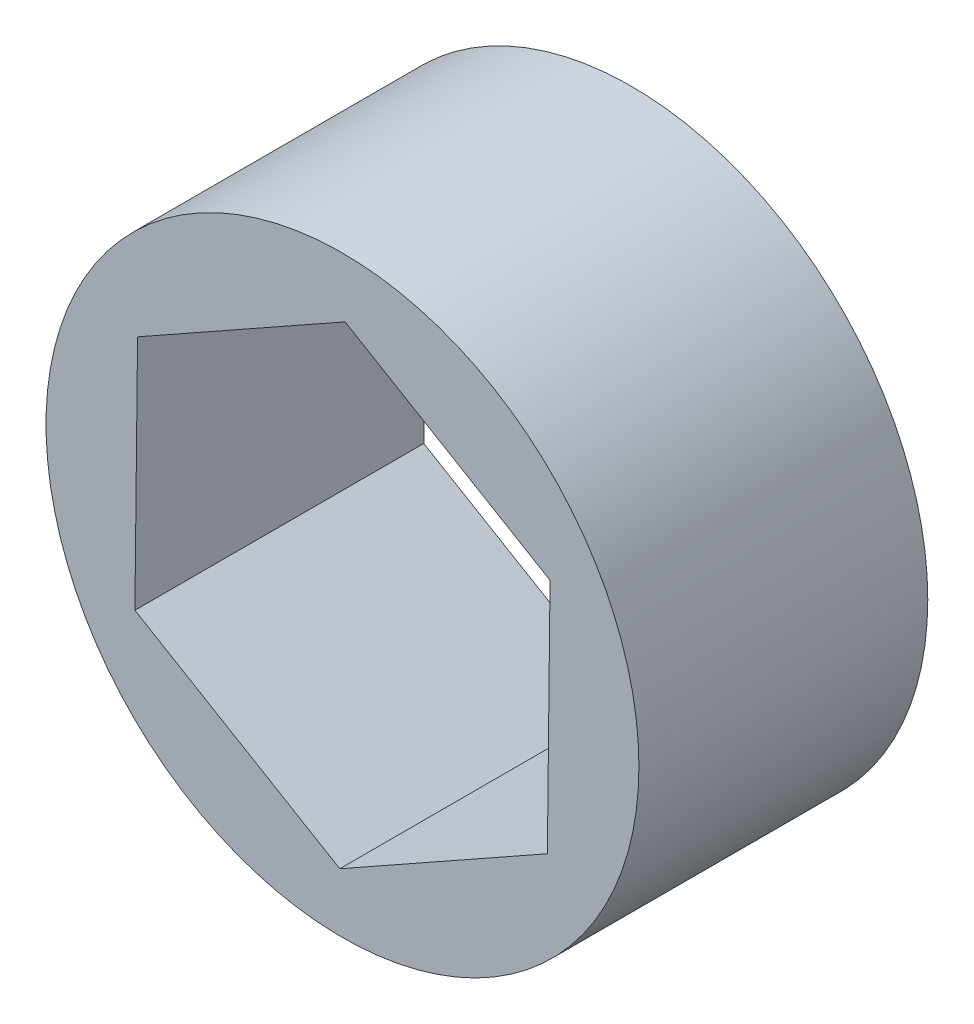
ISO-10303-21;
HEADER;
FILE_DESCRIPTION(('STEP AP214'),'2;1');
FILE_NAME('part.step','',(''),(''),'','','');
FILE_SCHEMA(('AUTOMOTIVE_DESIGN { 1 0 10303 214 1 1 1 1 }'));
ENDSEC;
DATA;
#1=APPLICATION_CONTEXT('core data for automotive mechanical design processes');
#2=APPLICATION_PROTOCOL_DEFINITION('international standard','automotive_design',2000,#1);
#3=PRODUCT_CONTEXT('',#1,'mechanical');
#4=PRODUCT('Part','Part','',(#3));
#5=PRODUCT_RELATED_PRODUCT_CATEGORY('part','',(#4));
#6=PRODUCT_DEFINITION_FORMATION('','',#4);
#7=PRODUCT_DEFINITION_CONTEXT('part definition',#1,'design');
#8=PRODUCT_DEFINITION('design','',#6,#7);
#9=PRODUCT_DEFINITION_SHAPE('','',#8);
#10=(LENGTH_UNIT() NAMED_UNIT(*) SI_UNIT(.MILLI.,.METRE.));
#11=(NAMED_UNIT(*) PLANE_ANGLE_UNIT() SI_UNIT($,.RADIAN.));
#12=(NAMED_UNIT(*) SI_UNIT($,.STERADIAN.) SOLID_ANGLE_UNIT());
#13=UNCERTAINTY_MEASURE_WITH_UNIT(LENGTH_MEASURE(1.E-05),#10,'distance_accuracy_value','');
#14=(GEOMETRIC_REPRESENTATION_CONTEXT(3) GLOBAL_UNCERTAINTY_ASSIGNED_CONTEXT((#13)) GLOBAL_UNIT_ASSIGNED_CONTEXT((#10,
#11,#12)) REPRESENTATION_CONTEXT('',''));
#15=CARTESIAN_POINT('',(0.,0.,0.));
#16=DIRECTION('',(0.,0.,1.));
#17=DIRECTION('',(1.,0.,0.));
#18=AXIS2_PLACEMENT_3D('',#15,#16,#17);
#19=CARTESIAN_POINT('',(0.,0.,9.16));
#20=DIRECTION('',(0.,0.,1.));
#21=DIRECTION('',(1.,0.,0.));
#22=AXIS2_PLACEMENT_3D('',#19,#20,#21);
#23=PLANE('',#22);
#24=CARTESIAN_POINT('',(0.,0.,9.16));
#25=DIRECTION('',(0.,0.,1.));
#26=DIRECTION('',(1.,0.,0.));
#27=AXIS2_PLACEMENT_3D('',#24,#25,#26);
#28=CIRCLE('',#27,9.4);
#29=CARTESIAN_POINT('',(9.4,0.,9.16));
#30=VERTEX_POINT('',#29);
#31=EDGE_CURVE('E11',#30,#30,#28,.T.);
#32=ORIENTED_EDGE('',*,*,#31,.T.);
#33=EDGE_LOOP('',(#32));
#34=FACE_BOUND('',#33,.T.);
#35=DIRECTION('',(0.0112070766876811,0.999937198744059,0.));
#36=VECTOR('',#35,1.);
#37=CARTESIAN_POINT('',(6.49727280661045,-3.84892791261156,9.16));
#38=LINE('',#37,#36);
#39=CARTESIAN_POINT('',(6.49727280661045,-3.84892791261156,9.16));
#40=VERTEX_POINT('',#39);
#41=CARTESIAN_POINT('',(6.58190575296185,3.70233934953669,9.16));
#42=VERTEX_POINT('',#41);
#43=EDGE_CURVE('E95',#40,#42,#38,.T.);
#44=ORIENTED_EDGE('',*,*,#43,.F.);
#45=DIRECTION('',(0.871574554645245,0.490262986258337,0.));
#46=VECTOR('',#45,1.);
#47=CARTESIAN_POINT('',(-0.0846329463513975,-7.55126726214825,9.16));
#48=LINE('',#47,#46);
#49=CARTESIAN_POINT('',(-0.0846329463513975,-7.55126726214825,9.16));
#50=VERTEX_POINT('',#49);
#51=EDGE_CURVE('E87',#50,#40,#48,.T.);
#52=ORIENTED_EDGE('',*,*,#51,.F.);
#53=DIRECTION('',(0.860367477957564,-0.509674212485722,0.));
#54=VECTOR('',#53,1.);
#55=CARTESIAN_POINT('',(-6.58190575296185,-3.70233934953669,9.16));
#56=LINE('',#55,#54);
#57=CARTESIAN_POINT('',(-6.58190575296185,-3.70233934953669,9.16));
#58=VERTEX_POINT('',#57);
#59=EDGE_CURVE('E115',#58,#50,#56,.T.);
#60=ORIENTED_EDGE('',*,*,#59,.F.);
#61=DIRECTION('',(-0.0112070766876816,-0.999937198744059,0.));
#62=VECTOR('',#61,1.);
#63=CARTESIAN_POINT('',(-6.49727280661045,3.84892791261156,9.16));
#64=LINE('',#63,#62);
#65=CARTESIAN_POINT('',(-6.49727280661045,3.84892791261156,9.16));
#66=VERTEX_POINT('',#65);
#67=EDGE_CURVE('E113',#66,#58,#64,.T.);
#68=ORIENTED_EDGE('',*,*,#67,.F.);
#69=DIRECTION('',(-0.871574554645245,-0.490262986258337,0.));
#70=VECTOR('',#69,1.);
#71=CARTESIAN_POINT('',(0.0846329463513967,7.55126726214825,9.16));
#72=LINE('',#71,#70);
#73=CARTESIAN_POINT('',(0.0846329463513967,7.55126726214825,9.16));
#74=VERTEX_POINT('',#73);
#75=EDGE_CURVE('E109',#74,#66,#72,.T.);
#76=ORIENTED_EDGE('',*,*,#75,.F.);
#77=DIRECTION('',(-0.860367477957564,0.509674212485722,0.));
#78=VECTOR('',#77,1.);
#79=CARTESIAN_POINT('',(6.58190575296185,3.70233934953669,9.16));
#80=LINE('',#79,#78);
#81=EDGE_CURVE('E107',#42,#74,#80,.T.);
#82=ORIENTED_EDGE('',*,*,#81,.F.);
#83=EDGE_LOOP('',(#44,#52,#60,#68,#76,#82));
#84=FACE_BOUND('',#83,.T.);
#85=ADVANCED_FACE('F34',(#34,#84),#23,.T.);
#86=CARTESIAN_POINT('',(0.,0.,0.));
#87=DIRECTION('',(0.,0.,1.));
#88=DIRECTION('',(1.,0.,0.));
#89=AXIS2_PLACEMENT_3D('',#86,#87,#88);
#90=PLANE('',#89);
#91=CARTESIAN_POINT('',(0.,0.,0.));
#92=DIRECTION('',(0.,0.,1.));
#93=DIRECTION('',(1.,0.,0.));
#94=AXIS2_PLACEMENT_3D('',#91,#92,#93);
#95=CIRCLE('',#94,9.4);
#96=CARTESIAN_POINT('',(9.4,0.,0.));
#97=VERTEX_POINT('',#96);
#98=EDGE_CURVE('E38',#97,#97,#95,.T.);
#99=ORIENTED_EDGE('',*,*,#98,.F.);
#100=EDGE_LOOP('',(#99));
#101=FACE_BOUND('',#100,.T.);
#102=DIRECTION('',(0.871574554645245,0.490262986258337,0.));
#103=VECTOR('',#102,1.);
#104=CARTESIAN_POINT('',(-0.0846329463513975,-7.55126726214825,0.));
#105=LINE('',#104,#103);
#106=CARTESIAN_POINT('',(-0.0846329463513977,-7.55126726214825,0.));
#107=VERTEX_POINT('',#106);
#108=CARTESIAN_POINT('',(6.49727280661045,-3.84892791261156,0.));
#109=VERTEX_POINT('',#108);
#110=EDGE_CURVE('E57',#107,#109,#105,.T.);
#111=ORIENTED_EDGE('',*,*,#110,.T.);
#112=DIRECTION('',(0.0112070766876811,0.999937198744059,0.));
#113=VECTOR('',#112,1.);
#114=CARTESIAN_POINT('',(6.49727280661045,-3.84892791261156,0.));
#115=LINE('',#114,#113);
#116=CARTESIAN_POINT('',(6.58190575296185,3.70233934953669,0.));
#117=VERTEX_POINT('',#116);
#118=EDGE_CURVE('E102',#109,#117,#115,.T.);
#119=ORIENTED_EDGE('',*,*,#118,.T.);
#120=DIRECTION('',(-0.860367477957564,0.509674212485722,0.));
#121=VECTOR('',#120,1.);
#122=CARTESIAN_POINT('',(6.58190575296185,3.70233934953669,0.));
#123=LINE('',#122,#121);
#124=CARTESIAN_POINT('',(0.0846329463513967,7.55126726214825,0.));
#125=VERTEX_POINT('',#124);
#126=EDGE_CURVE('E119',#117,#125,#123,.T.);
#127=ORIENTED_EDGE('',*,*,#126,.T.);
#128=DIRECTION('',(-0.871574554645245,-0.490262986258337,0.));
#129=VECTOR('',#128,1.);
#130=CARTESIAN_POINT('',(0.0846329463513967,7.55126726214825,0.));
#131=LINE('',#130,#129);
#132=CARTESIAN_POINT('',(-6.49727280661045,3.84892791261156,0.));
#133=VERTEX_POINT('',#132);
#134=EDGE_CURVE('E122',#125,#133,#131,.T.);
#135=ORIENTED_EDGE('',*,*,#134,.T.);
#136=DIRECTION('',(-0.0112070766876816,-0.999937198744059,0.));
#137=VECTOR('',#136,1.);
#138=CARTESIAN_POINT('',(-6.49727280661045,3.84892791261156,0.));
#139=LINE('',#138,#137);
#140=CARTESIAN_POINT('',(-6.58190575296185,-3.70233934953669,0.));
#141=VERTEX_POINT('',#140);
#142=EDGE_CURVE('E125',#133,#141,#139,.T.);
#143=ORIENTED_EDGE('',*,*,#142,.T.);
#144=DIRECTION('',(0.860367477957564,-0.509674212485722,0.));
#145=VECTOR('',#144,1.);
#146=CARTESIAN_POINT('',(-6.58190575296185,-3.70233934953669,0.));
#147=LINE('',#146,#145);
#148=EDGE_CURVE('E96',#141,#107,#147,.T.);
#149=ORIENTED_EDGE('',*,*,#148,.T.);
#150=EDGE_LOOP('',(#111,#119,#127,#135,#143,#149));
#151=FACE_BOUND('',#150,.T.);
#152=ADVANCED_FACE('F142',(#101,#151),#90,.F.);
#153=CARTESIAN_POINT('',(0.,0.,9.16));
#154=DIRECTION('',(0.,0.,-1.));
#155=DIRECTION('',(-1.,0.,0.));
#156=AXIS2_PLACEMENT_3D('',#153,#154,#155);
#157=CYLINDRICAL_SURFACE('',#156,9.4);
#158=ORIENTED_EDGE('',*,*,#31,.F.);
#159=EDGE_LOOP('',(#158));
#160=FACE_BOUND('',#159,.T.);
#161=ORIENTED_EDGE('',*,*,#98,.T.);
#162=EDGE_LOOP('',(#161));
#163=FACE_BOUND('',#162,.T.);
#164=ADVANCED_FACE('F36',(#160,#163),#157,.T.);
#165=CARTESIAN_POINT('',(-0.0846329463513975,-7.55126726214825,9.16));
#166=DIRECTION('',(-0.490262986258337,0.871574554645245,0.));
#167=DIRECTION('',(-0.871574554645245,-0.490262986258337,0.));
#168=AXIS2_PLACEMENT_3D('',#165,#166,#167);
#169=PLANE('',#168);
#170=ORIENTED_EDGE('',*,*,#110,.F.);
#171=DIRECTION('',(0.,0.,-1.));
#172=VECTOR('',#171,1.);
#173=CARTESIAN_POINT('',(-0.0846329463513975,-7.55126726214825,9.16));
#174=LINE('',#173,#172);
#175=EDGE_CURVE('E91',#50,#107,#174,.T.);
#176=ORIENTED_EDGE('',*,*,#175,.F.);
#177=ORIENTED_EDGE('',*,*,#51,.T.);
#178=DIRECTION('',(0.,0.,-1.));
#179=VECTOR('',#178,1.);
#180=CARTESIAN_POINT('',(6.49727280661045,-3.84892791261156,9.16));
#181=LINE('',#180,#179);
#182=EDGE_CURVE('E90',#40,#109,#181,.T.);
#183=ORIENTED_EDGE('',*,*,#182,.T.);
#184=EDGE_LOOP('',(#170,#176,#177,#183));
#185=FACE_BOUND('',#184,.T.);
#186=ADVANCED_FACE('F89',(#185),#169,.T.);
#187=CARTESIAN_POINT('',(6.49727280661045,-3.84892791261156,9.16));
#188=DIRECTION('',(-0.999937198744059,0.0112070766876811,0.));
#189=DIRECTION('',(-0.0112070766876811,-0.999937198744059,0.));
#190=AXIS2_PLACEMENT_3D('',#187,#188,#189);
#191=PLANE('',#190);
#192=ORIENTED_EDGE('',*,*,#118,.F.);
#193=ORIENTED_EDGE('',*,*,#182,.F.);
#194=ORIENTED_EDGE('',*,*,#43,.T.);
#195=DIRECTION('',(0.,0.,-1.));
#196=VECTOR('',#195,1.);
#197=CARTESIAN_POINT('',(6.58190575296185,3.70233934953669,9.16));
#198=LINE('',#197,#196);
#199=EDGE_CURVE('E103',#42,#117,#198,.T.);
#200=ORIENTED_EDGE('',*,*,#199,.T.);
#201=EDGE_LOOP('',(#192,#193,#194,#200));
#202=FACE_BOUND('',#201,.T.);
#203=ADVANCED_FACE('F99',(#202),#191,.T.);
#204=CARTESIAN_POINT('',(6.58190575296185,3.70233934953669,9.16));
#205=DIRECTION('',(-0.509674212485722,-0.860367477957564,0.));
#206=DIRECTION('',(0.860367477957564,-0.509674212485722,0.));
#207=AXIS2_PLACEMENT_3D('',#204,#205,#206);
#208=PLANE('',#207);
#209=ORIENTED_EDGE('',*,*,#126,.F.);
#210=ORIENTED_EDGE('',*,*,#199,.F.);
#211=ORIENTED_EDGE('',*,*,#81,.T.);
#212=DIRECTION('',(0.,0.,-1.));
#213=VECTOR('',#212,1.);
#214=CARTESIAN_POINT('',(0.0846329463513967,7.55126726214825,9.16));
#215=LINE('',#214,#213);
#216=EDGE_CURVE('E134',#74,#125,#215,.T.);
#217=ORIENTED_EDGE('',*,*,#216,.T.);
#218=EDGE_LOOP('',(#209,#210,#211,#217));
#219=FACE_BOUND('',#218,.T.);
#220=ADVANCED_FACE('F138',(#219),#208,.T.);
#221=CARTESIAN_POINT('',(0.0846329463513967,7.55126726214825,9.16));
#222=DIRECTION('',(0.490262986258337,-0.871574554645245,0.));
#223=DIRECTION('',(0.871574554645245,0.490262986258337,0.));
#224=AXIS2_PLACEMENT_3D('',#221,#222,#223);
#225=PLANE('',#224);
#226=ORIENTED_EDGE('',*,*,#134,.F.);
#227=ORIENTED_EDGE('',*,*,#216,.F.);
#228=ORIENTED_EDGE('',*,*,#75,.T.);
#229=DIRECTION('',(0.,0.,-1.));
#230=VECTOR('',#229,1.);
#231=CARTESIAN_POINT('',(-6.49727280661045,3.84892791261156,9.16));
#232=LINE('',#231,#230);
#233=EDGE_CURVE('E132',#66,#133,#232,.T.);
#234=ORIENTED_EDGE('',*,*,#233,.T.);
#235=EDGE_LOOP('',(#226,#227,#228,#234));
#236=FACE_BOUND('',#235,.T.);
#237=ADVANCED_FACE('F150',(#236),#225,.T.);
#238=CARTESIAN_POINT('',(-6.49727280661045,3.84892791261156,9.16));
#239=DIRECTION('',(0.999937198744059,-0.0112070766876816,0.));
#240=DIRECTION('',(0.0112070766876816,0.999937198744059,0.));
#241=AXIS2_PLACEMENT_3D('',#238,#239,#240);
#242=PLANE('',#241);
#243=ORIENTED_EDGE('',*,*,#142,.F.);
#244=ORIENTED_EDGE('',*,*,#233,.F.);
#245=ORIENTED_EDGE('',*,*,#67,.T.);
#246=DIRECTION('',(0.,0.,-1.));
#247=VECTOR('',#246,1.);
#248=CARTESIAN_POINT('',(-6.58190575296185,-3.70233934953669,9.16));
#249=LINE('',#248,#247);
#250=EDGE_CURVE('E49',#58,#141,#249,.T.);
#251=ORIENTED_EDGE('',*,*,#250,.T.);
#252=EDGE_LOOP('',(#243,#244,#245,#251));
#253=FACE_BOUND('',#252,.T.);
#254=ADVANCED_FACE('F148',(#253),#242,.T.);
#255=CARTESIAN_POINT('',(-6.58190575296185,-3.70233934953669,9.16));
#256=DIRECTION('',(0.509674212485722,0.860367477957564,0.));
#257=DIRECTION('',(-0.860367477957564,0.509674212485722,0.));
#258=AXIS2_PLACEMENT_3D('',#255,#256,#257);
#259=PLANE('',#258);
#260=ORIENTED_EDGE('',*,*,#148,.F.);
#261=ORIENTED_EDGE('',*,*,#250,.F.);
#262=ORIENTED_EDGE('',*,*,#59,.T.);
#263=ORIENTED_EDGE('',*,*,#175,.T.);
#264=EDGE_LOOP('',(#260,#261,#262,#263));
#265=FACE_BOUND('',#264,.T.);
#266=ADVANCED_FACE('F144',(#265),#259,.T.);
#267=CLOSED_SHELL('',(#85,#152,#164,#186,#203,#220,#237,#254,#266));
#268=MANIFOLD_SOLID_BREP('B2',#267);
#269=ADVANCED_BREP_SHAPE_REPRESENTATION('',(#18,#268),#14);
#270=SHAPE_DEFINITION_REPRESENTATION(#9,#269);
ENDSEC;
END-ISO-10303-21;
